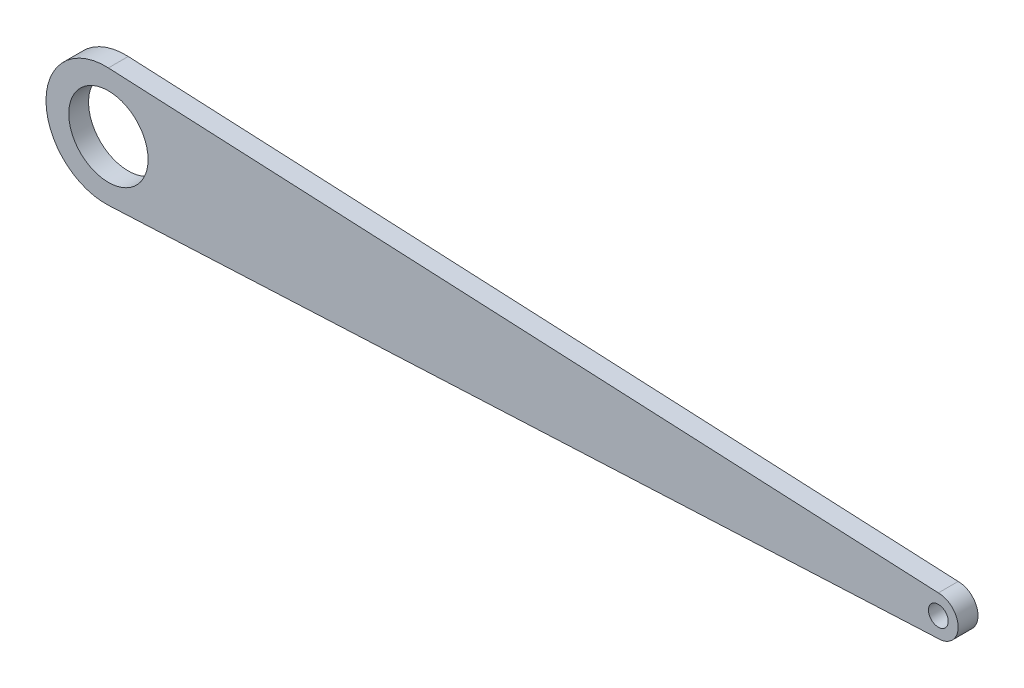
ISO-10303-21;
HEADER;
FILE_DESCRIPTION(('STEP AP214'),'2;1');
FILE_NAME('part.step','',(''),(''),'','','');
FILE_SCHEMA(('AUTOMOTIVE_DESIGN { 1 0 10303 214 1 1 1 1 }'));
ENDSEC;
DATA;
#1=APPLICATION_CONTEXT('core data for automotive mechanical design processes');
#2=APPLICATION_PROTOCOL_DEFINITION('international standard','automotive_design',2000,#1);
#3=PRODUCT_CONTEXT('',#1,'mechanical');
#4=PRODUCT('Part','Part','',(#3));
#5=PRODUCT_RELATED_PRODUCT_CATEGORY('part','',(#4));
#6=PRODUCT_DEFINITION_FORMATION('','',#4);
#7=PRODUCT_DEFINITION_CONTEXT('part definition',#1,'design');
#8=PRODUCT_DEFINITION('design','',#6,#7);
#9=PRODUCT_DEFINITION_SHAPE('','',#8);
#10=(LENGTH_UNIT() NAMED_UNIT(*) SI_UNIT(.MILLI.,.METRE.));
#11=(NAMED_UNIT(*) PLANE_ANGLE_UNIT() SI_UNIT($,.RADIAN.));
#12=(NAMED_UNIT(*) SI_UNIT($,.STERADIAN.) SOLID_ANGLE_UNIT());
#13=UNCERTAINTY_MEASURE_WITH_UNIT(LENGTH_MEASURE(1.E-05),#10,'distance_accuracy_value','');
#14=(GEOMETRIC_REPRESENTATION_CONTEXT(3) GLOBAL_UNCERTAINTY_ASSIGNED_CONTEXT((#13)) GLOBAL_UNIT_ASSIGNED_CONTEXT((#10,
#11,#12)) REPRESENTATION_CONTEXT('',''));
#15=CARTESIAN_POINT('',(0.,0.,0.));
#16=DIRECTION('',(0.,0.,1.));
#17=DIRECTION('',(1.,0.,0.));
#18=AXIS2_PLACEMENT_3D('',#15,#16,#17);
#19=CARTESIAN_POINT('',(104.635,0.,5.));
#20=DIRECTION('',(0.,0.,-1.));
#21=DIRECTION('',(-1.,0.,0.));
#22=AXIS2_PLACEMENT_3D('',#19,#20,#21);
#23=PLANE('',#22);
#24=CARTESIAN_POINT('',(104.635,0.,5.));
#25=DIRECTION('',(0.,0.,1.));
#26=DIRECTION('',(-1.,0.,0.));
#27=AXIS2_PLACEMENT_3D('',#24,#25,#26);
#28=CIRCLE('',#27,5.);
#29=CARTESIAN_POINT('',(104.635,-5.,5.));
#30=VERTEX_POINT('',#29);
#31=CARTESIAN_POINT('',(104.635,5.,5.));
#32=VERTEX_POINT('',#31);
#33=EDGE_CURVE('E91',#30,#32,#28,.T.);
#34=ORIENTED_EDGE('',*,*,#33,.T.);
#35=DIRECTION('',(-0.998860240882508,0.0477306943605155,0.));
#36=VECTOR('',#35,1.);
#37=CARTESIAN_POINT('',(-104.635,15.,5.));
#38=LINE('',#37,#36);
#39=CARTESIAN_POINT('',(-104.635,15.,5.));
#40=VERTEX_POINT('',#39);
#41=EDGE_CURVE('E86',#32,#40,#38,.T.);
#42=ORIENTED_EDGE('',*,*,#41,.T.);
#43=CARTESIAN_POINT('',(-105.351777368949,0.,5.));
#44=DIRECTION('',(0.,0.,1.));
#45=DIRECTION('',(1.,0.,0.));
#46=AXIS2_PLACEMENT_3D('',#43,#44,#45);
#47=CIRCLE('',#46,15.0171158947595);
#48=CARTESIAN_POINT('',(-104.635,-15.,5.));
#49=VERTEX_POINT('',#48);
#50=EDGE_CURVE('E89',#40,#49,#47,.T.);
#51=ORIENTED_EDGE('',*,*,#50,.T.);
#52=DIRECTION('',(0.998860240882508,0.0477306943605155,0.));
#53=VECTOR('',#52,1.);
#54=CARTESIAN_POINT('',(-104.635,-15.,5.));
#55=LINE('',#54,#53);
#56=EDGE_CURVE('E56',#49,#30,#55,.T.);
#57=ORIENTED_EDGE('',*,*,#56,.T.);
#58=EDGE_LOOP('',(#34,#42,#51,#57));
#59=FACE_BOUND('',#58,.T.);
#60=CARTESIAN_POINT('',(-104.635,0.,5.));
#61=DIRECTION('',(0.,0.,1.));
#62=DIRECTION('',(1.,0.,0.));
#63=AXIS2_PLACEMENT_3D('',#60,#61,#62);
#64=CIRCLE('',#63,9.99999999999999);
#65=CARTESIAN_POINT('',(-94.635,0.,5.));
#66=VERTEX_POINT('',#65);
#67=EDGE_CURVE('E106',#66,#66,#64,.T.);
#68=ORIENTED_EDGE('',*,*,#67,.F.);
#69=EDGE_LOOP('',(#68));
#70=FACE_BOUND('',#69,.T.);
#71=CARTESIAN_POINT('',(104.635,0.,5.));
#72=DIRECTION('',(0.,0.,1.));
#73=DIRECTION('',(1.,0.,0.));
#74=AXIS2_PLACEMENT_3D('',#71,#72,#73);
#75=CIRCLE('',#74,2.5);
#76=CARTESIAN_POINT('',(107.135,0.,5.));
#77=VERTEX_POINT('',#76);
#78=EDGE_CURVE('E121',#77,#77,#75,.T.);
#79=ORIENTED_EDGE('',*,*,#78,.F.);
#80=EDGE_LOOP('',(#79));
#81=FACE_BOUND('',#80,.T.);
#82=ADVANCED_FACE('F39',(#59,#70,#81),#23,.F.);
#83=CARTESIAN_POINT('',(104.635,0.,0.));
#84=DIRECTION('',(0.,0.,-1.));
#85=DIRECTION('',(-1.,0.,0.));
#86=AXIS2_PLACEMENT_3D('',#83,#84,#85);
#87=PLANE('',#86);
#88=CARTESIAN_POINT('',(-104.635,0.,0.));
#89=DIRECTION('',(0.,0.,1.));
#90=DIRECTION('',(1.,0.,0.));
#91=AXIS2_PLACEMENT_3D('',#88,#89,#90);
#92=CIRCLE('',#91,9.99999999999999);
#93=CARTESIAN_POINT('',(-94.635,0.,0.));
#94=VERTEX_POINT('',#93);
#95=EDGE_CURVE('E118',#94,#94,#92,.T.);
#96=ORIENTED_EDGE('',*,*,#95,.T.);
#97=EDGE_LOOP('',(#96));
#98=FACE_BOUND('',#97,.T.);
#99=CARTESIAN_POINT('',(104.635,0.,0.));
#100=DIRECTION('',(0.,0.,1.));
#101=DIRECTION('',(-1.,0.,0.));
#102=AXIS2_PLACEMENT_3D('',#99,#100,#101);
#103=CIRCLE('',#102,5.);
#104=CARTESIAN_POINT('',(104.635,-5.,0.));
#105=VERTEX_POINT('',#104);
#106=CARTESIAN_POINT('',(104.635,5.,0.));
#107=VERTEX_POINT('',#106);
#108=EDGE_CURVE('E103',#105,#107,#103,.T.);
#109=ORIENTED_EDGE('',*,*,#108,.F.);
#110=DIRECTION('',(0.998860240882508,0.0477306943605155,0.));
#111=VECTOR('',#110,1.);
#112=CARTESIAN_POINT('',(-104.635,-15.,0.));
#113=LINE('',#112,#111);
#114=CARTESIAN_POINT('',(-104.635,-15.,0.));
#115=VERTEX_POINT('',#114);
#116=EDGE_CURVE('E79',#115,#105,#113,.T.);
#117=ORIENTED_EDGE('',*,*,#116,.F.);
#118=CARTESIAN_POINT('',(-105.351777368949,0.,0.));
#119=DIRECTION('',(0.,0.,1.));
#120=DIRECTION('',(1.,0.,0.));
#121=AXIS2_PLACEMENT_3D('',#118,#119,#120);
#122=CIRCLE('',#121,15.0171158947595);
#123=CARTESIAN_POINT('',(-104.635,15.,0.));
#124=VERTEX_POINT('',#123);
#125=EDGE_CURVE('E73',#124,#115,#122,.T.);
#126=ORIENTED_EDGE('',*,*,#125,.F.);
#127=DIRECTION('',(-0.998860240882508,0.0477306943605155,0.));
#128=VECTOR('',#127,1.);
#129=CARTESIAN_POINT('',(-104.635,15.,0.));
#130=LINE('',#129,#128);
#131=EDGE_CURVE('E95',#107,#124,#130,.T.);
#132=ORIENTED_EDGE('',*,*,#131,.F.);
#133=EDGE_LOOP('',(#109,#117,#126,#132));
#134=FACE_BOUND('',#133,.T.);
#135=CARTESIAN_POINT('',(104.635,0.,0.));
#136=DIRECTION('',(0.,0.,1.));
#137=DIRECTION('',(1.,0.,0.));
#138=AXIS2_PLACEMENT_3D('',#135,#136,#137);
#139=CIRCLE('',#138,2.5);
#140=CARTESIAN_POINT('',(107.135,0.,0.));
#141=VERTEX_POINT('',#140);
#142=EDGE_CURVE('E124',#141,#141,#139,.T.);
#143=ORIENTED_EDGE('',*,*,#142,.T.);
#144=EDGE_LOOP('',(#143));
#145=FACE_BOUND('',#144,.T.);
#146=ADVANCED_FACE('F114',(#98,#134,#145),#87,.T.);
#147=CARTESIAN_POINT('',(104.635,0.,5.));
#148=DIRECTION('',(0.,0.,-1.));
#149=DIRECTION('',(-1.,0.,0.));
#150=AXIS2_PLACEMENT_3D('',#147,#148,#149);
#151=CYLINDRICAL_SURFACE('',#150,5.);
#152=ORIENTED_EDGE('',*,*,#108,.T.);
#153=DIRECTION('',(0.,0.,-1.));
#154=VECTOR('',#153,1.);
#155=CARTESIAN_POINT('',(104.635,5.,5.));
#156=LINE('',#155,#154);
#157=EDGE_CURVE('E11',#32,#107,#156,.T.);
#158=ORIENTED_EDGE('',*,*,#157,.F.);
#159=ORIENTED_EDGE('',*,*,#33,.F.);
#160=DIRECTION('',(0.,0.,-1.));
#161=VECTOR('',#160,1.);
#162=CARTESIAN_POINT('',(104.635,-5.,5.));
#163=LINE('',#162,#161);
#164=EDGE_CURVE('E99',#30,#105,#163,.T.);
#165=ORIENTED_EDGE('',*,*,#164,.T.);
#166=EDGE_LOOP('',(#152,#158,#159,#165));
#167=FACE_BOUND('',#166,.T.);
#168=ADVANCED_FACE('F41',(#167),#151,.T.);
#169=CARTESIAN_POINT('',(-104.635,15.,5.));
#170=DIRECTION('',(-0.0477306943605155,-0.998860240882509,0.));
#171=DIRECTION('',(0.998860240882509,-0.0477306943605155,0.));
#172=AXIS2_PLACEMENT_3D('',#169,#170,#171);
#173=PLANE('',#172);
#174=ORIENTED_EDGE('',*,*,#131,.T.);
#175=DIRECTION('',(0.,0.,-1.));
#176=VECTOR('',#175,1.);
#177=CARTESIAN_POINT('',(-104.635,15.,5.));
#178=LINE('',#177,#176);
#179=EDGE_CURVE('E48',#40,#124,#178,.T.);
#180=ORIENTED_EDGE('',*,*,#179,.F.);
#181=ORIENTED_EDGE('',*,*,#41,.F.);
#182=ORIENTED_EDGE('',*,*,#157,.T.);
#183=EDGE_LOOP('',(#174,#180,#181,#182));
#184=FACE_BOUND('',#183,.T.);
#185=ADVANCED_FACE('F94',(#184),#173,.F.);
#186=CARTESIAN_POINT('',(-105.351777368949,0.,5.));
#187=DIRECTION('',(0.,0.,-1.));
#188=DIRECTION('',(-1.,0.,0.));
#189=AXIS2_PLACEMENT_3D('',#186,#187,#188);
#190=CYLINDRICAL_SURFACE('',#189,15.0171158947595);
#191=ORIENTED_EDGE('',*,*,#125,.T.);
#192=DIRECTION('',(0.,0.,-1.));
#193=VECTOR('',#192,1.);
#194=CARTESIAN_POINT('',(-104.635,-15.,5.));
#195=LINE('',#194,#193);
#196=EDGE_CURVE('E96',#49,#115,#195,.T.);
#197=ORIENTED_EDGE('',*,*,#196,.F.);
#198=ORIENTED_EDGE('',*,*,#50,.F.);
#199=ORIENTED_EDGE('',*,*,#179,.T.);
#200=EDGE_LOOP('',(#191,#197,#198,#199));
#201=FACE_BOUND('',#200,.T.);
#202=ADVANCED_FACE('F97',(#201),#190,.T.);
#203=CARTESIAN_POINT('',(-104.635,-15.,5.));
#204=DIRECTION('',(-0.0477306943605156,0.998860240882509,0.));
#205=DIRECTION('',(-0.998860240882509,-0.0477306943605156,0.));
#206=AXIS2_PLACEMENT_3D('',#203,#204,#205);
#207=PLANE('',#206);
#208=ORIENTED_EDGE('',*,*,#116,.T.);
#209=ORIENTED_EDGE('',*,*,#164,.F.);
#210=ORIENTED_EDGE('',*,*,#56,.F.);
#211=ORIENTED_EDGE('',*,*,#196,.T.);
#212=EDGE_LOOP('',(#208,#209,#210,#211));
#213=FACE_BOUND('',#212,.T.);
#214=ADVANCED_FACE('F111',(#213),#207,.F.);
#215=CARTESIAN_POINT('',(-104.635,0.,5.));
#216=DIRECTION('',(0.,0.,-1.));
#217=DIRECTION('',(-1.,0.,0.));
#218=AXIS2_PLACEMENT_3D('',#215,#216,#217);
#219=CYLINDRICAL_SURFACE('',#218,9.99999999999999);
#220=ORIENTED_EDGE('',*,*,#67,.T.);
#221=EDGE_LOOP('',(#220));
#222=FACE_BOUND('',#221,.T.);
#223=ORIENTED_EDGE('',*,*,#95,.F.);
#224=EDGE_LOOP('',(#223));
#225=FACE_BOUND('',#224,.T.);
#226=ADVANCED_FACE('F141',(#222,#225),#219,.F.);
#227=CARTESIAN_POINT('',(104.635,0.,5.));
#228=DIRECTION('',(0.,0.,-1.));
#229=DIRECTION('',(-1.,0.,0.));
#230=AXIS2_PLACEMENT_3D('',#227,#228,#229);
#231=CYLINDRICAL_SURFACE('',#230,2.5);
#232=ORIENTED_EDGE('',*,*,#78,.T.);
#233=EDGE_LOOP('',(#232));
#234=FACE_BOUND('',#233,.T.);
#235=ORIENTED_EDGE('',*,*,#142,.F.);
#236=EDGE_LOOP('',(#235));
#237=FACE_BOUND('',#236,.T.);
#238=ADVANCED_FACE('F130',(#234,#237),#231,.F.);
#239=CLOSED_SHELL('',(#82,#146,#168,#185,#202,#214,#226,#238));
#240=MANIFOLD_SOLID_BREP('B2',#239);
#241=ADVANCED_BREP_SHAPE_REPRESENTATION('',(#18,#240),#14);
#242=SHAPE_DEFINITION_REPRESENTATION(#9,#241);
ENDSEC;
END-ISO-10303-21;
